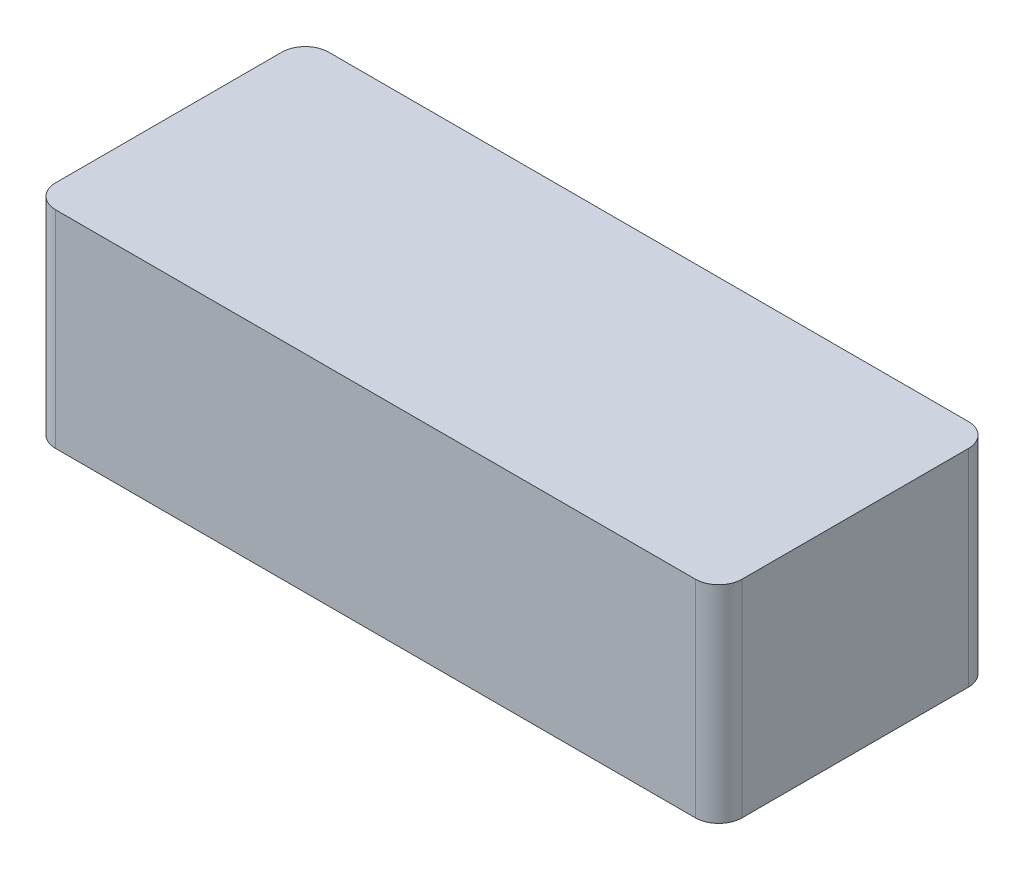
ISO-10303-21;
HEADER;
FILE_DESCRIPTION(('STEP AP214'),'2;1');
FILE_NAME('part.step','',(''),(''),'','','');
FILE_SCHEMA(('AUTOMOTIVE_DESIGN { 1 0 10303 214 1 1 1 1 }'));
ENDSEC;
DATA;
#1=APPLICATION_CONTEXT('core data for automotive mechanical design processes');
#2=APPLICATION_PROTOCOL_DEFINITION('international standard','automotive_design',2000,#1);
#3=PRODUCT_CONTEXT('',#1,'mechanical');
#4=PRODUCT('Part','Part','',(#3));
#5=PRODUCT_RELATED_PRODUCT_CATEGORY('part','',(#4));
#6=PRODUCT_DEFINITION_FORMATION('','',#4);
#7=PRODUCT_DEFINITION_CONTEXT('part definition',#1,'design');
#8=PRODUCT_DEFINITION('design','',#6,#7);
#9=PRODUCT_DEFINITION_SHAPE('','',#8);
#10=(LENGTH_UNIT() NAMED_UNIT(*) SI_UNIT(.MILLI.,.METRE.));
#11=(NAMED_UNIT(*) PLANE_ANGLE_UNIT() SI_UNIT($,.RADIAN.));
#12=(NAMED_UNIT(*) SI_UNIT($,.STERADIAN.) SOLID_ANGLE_UNIT());
#13=UNCERTAINTY_MEASURE_WITH_UNIT(LENGTH_MEASURE(1.E-05),#10,'distance_accuracy_value','');
#14=(GEOMETRIC_REPRESENTATION_CONTEXT(3) GLOBAL_UNCERTAINTY_ASSIGNED_CONTEXT((#13)) GLOBAL_UNIT_ASSIGNED_CONTEXT((#10,
#11,#12)) REPRESENTATION_CONTEXT('',''));
#15=CARTESIAN_POINT('',(0.,0.,0.));
#16=DIRECTION('',(0.,0.,1.));
#17=DIRECTION('',(1.,0.,0.));
#18=AXIS2_PLACEMENT_3D('',#15,#16,#17);
#19=CARTESIAN_POINT('',(41.,26.5,14.5));
#20=DIRECTION('',(0.,-1.,0.));
#21=DIRECTION('',(0.,0.,-1.));
#22=AXIS2_PLACEMENT_3D('',#19,#20,#21);
#23=CYLINDRICAL_SURFACE('',#22,3.);
#24=CARTESIAN_POINT('',(41.,0.,14.5));
#25=DIRECTION('',(0.,1.,0.));
#26=DIRECTION('',(0.,0.,1.));
#27=AXIS2_PLACEMENT_3D('',#24,#25,#26);
#28=CIRCLE('',#27,3.);
#29=CARTESIAN_POINT('',(41.,0.,17.5));
#30=VERTEX_POINT('',#29);
#31=CARTESIAN_POINT('',(44.,0.,14.5));
#32=VERTEX_POINT('',#31);
#33=EDGE_CURVE('E216',#30,#32,#28,.T.);
#34=ORIENTED_EDGE('',*,*,#33,.T.);
#35=DIRECTION('',(0.,-1.,0.));
#36=VECTOR('',#35,1.);
#37=CARTESIAN_POINT('',(44.,26.5,14.5));
#38=LINE('',#37,#36);
#39=CARTESIAN_POINT('',(44.,26.5,14.5));
#40=VERTEX_POINT('',#39);
#41=EDGE_CURVE('E11',#40,#32,#38,.T.);
#42=ORIENTED_EDGE('',*,*,#41,.F.);
#43=CARTESIAN_POINT('',(41.,26.5,14.5));
#44=DIRECTION('',(0.,1.,0.));
#45=DIRECTION('',(0.,0.,1.));
#46=AXIS2_PLACEMENT_3D('',#43,#44,#45);
#47=CIRCLE('',#46,3.);
#48=CARTESIAN_POINT('',(41.,26.5,17.5));
#49=VERTEX_POINT('',#48);
#50=EDGE_CURVE('E217',#49,#40,#47,.T.);
#51=ORIENTED_EDGE('',*,*,#50,.F.);
#52=DIRECTION('',(0.,-1.,0.));
#53=VECTOR('',#52,1.);
#54=CARTESIAN_POINT('',(41.,26.5,17.5));
#55=LINE('',#54,#53);
#56=EDGE_CURVE('E235',#49,#30,#55,.T.);
#57=ORIENTED_EDGE('',*,*,#56,.T.);
#58=EDGE_LOOP('',(#34,#42,#51,#57));
#59=FACE_BOUND('',#58,.T.);
#60=ADVANCED_FACE('F43',(#59),#23,.T.);
#61=CARTESIAN_POINT('',(44.,26.5,14.5));
#62=DIRECTION('',(-1.,0.,0.));
#63=DIRECTION('',(0.,0.,1.));
#64=AXIS2_PLACEMENT_3D('',#61,#62,#63);
#65=PLANE('',#64);
#66=DIRECTION('',(0.,0.,-1.));
#67=VECTOR('',#66,1.);
#68=CARTESIAN_POINT('',(44.,0.,14.5));
#69=LINE('',#68,#67);
#70=CARTESIAN_POINT('',(44.,0.,-14.5));
#71=VERTEX_POINT('',#70);
#72=EDGE_CURVE('E238',#32,#71,#69,.T.);
#73=ORIENTED_EDGE('',*,*,#72,.T.);
#74=DIRECTION('',(0.,-1.,0.));
#75=VECTOR('',#74,1.);
#76=CARTESIAN_POINT('',(44.,26.5,-14.5));
#77=LINE('',#76,#75);
#78=CARTESIAN_POINT('',(44.,26.5,-14.5));
#79=VERTEX_POINT('',#78);
#80=EDGE_CURVE('E50',#79,#71,#77,.T.);
#81=ORIENTED_EDGE('',*,*,#80,.F.);
#82=DIRECTION('',(0.,0.,-1.));
#83=VECTOR('',#82,1.);
#84=CARTESIAN_POINT('',(44.,26.5,14.5));
#85=LINE('',#84,#83);
#86=EDGE_CURVE('E220',#40,#79,#85,.T.);
#87=ORIENTED_EDGE('',*,*,#86,.F.);
#88=ORIENTED_EDGE('',*,*,#41,.T.);
#89=EDGE_LOOP('',(#73,#81,#87,#88));
#90=FACE_BOUND('',#89,.T.);
#91=ADVANCED_FACE('F295',(#90),#65,.F.);
#92=CARTESIAN_POINT('',(41.,26.5,-14.5));
#93=DIRECTION('',(0.,-1.,0.));
#94=DIRECTION('',(0.,0.,-1.));
#95=AXIS2_PLACEMENT_3D('',#92,#93,#94);
#96=CYLINDRICAL_SURFACE('',#95,3.);
#97=CARTESIAN_POINT('',(41.,0.,-14.5));
#98=DIRECTION('',(0.,1.,0.));
#99=DIRECTION('',(0.,0.,-1.));
#100=AXIS2_PLACEMENT_3D('',#97,#98,#99);
#101=CIRCLE('',#100,3.);
#102=CARTESIAN_POINT('',(41.,0.,-17.5));
#103=VERTEX_POINT('',#102);
#104=EDGE_CURVE('E240',#71,#103,#101,.T.);
#105=ORIENTED_EDGE('',*,*,#104,.T.);
#106=DIRECTION('',(0.,-1.,0.));
#107=VECTOR('',#106,1.);
#108=CARTESIAN_POINT('',(41.,26.5,-17.5));
#109=LINE('',#108,#107);
#110=CARTESIAN_POINT('',(41.,26.5,-17.5));
#111=VERTEX_POINT('',#110);
#112=EDGE_CURVE('E265',#111,#103,#109,.T.);
#113=ORIENTED_EDGE('',*,*,#112,.F.);
#114=CARTESIAN_POINT('',(41.,26.5,-14.5));
#115=DIRECTION('',(0.,1.,0.));
#116=DIRECTION('',(0.,0.,-1.));
#117=AXIS2_PLACEMENT_3D('',#114,#115,#116);
#118=CIRCLE('',#117,3.);
#119=EDGE_CURVE('E223',#79,#111,#118,.T.);
#120=ORIENTED_EDGE('',*,*,#119,.F.);
#121=ORIENTED_EDGE('',*,*,#80,.T.);
#122=EDGE_LOOP('',(#105,#113,#120,#121));
#123=FACE_BOUND('',#122,.T.);
#124=ADVANCED_FACE('F272',(#123),#96,.T.);
#125=CARTESIAN_POINT('',(-41.,26.5,-17.5));
#126=DIRECTION('',(0.,0.,1.));
#127=DIRECTION('',(1.,0.,0.));
#128=AXIS2_PLACEMENT_3D('',#125,#126,#127);
#129=PLANE('',#128);
#130=DIRECTION('',(-1.,0.,0.));
#131=VECTOR('',#130,1.);
#132=CARTESIAN_POINT('',(-41.,0.,-17.5));
#133=LINE('',#132,#131);
#134=CARTESIAN_POINT('',(-41.,0.,-17.5));
#135=VERTEX_POINT('',#134);
#136=EDGE_CURVE('E242',#103,#135,#133,.T.);
#137=ORIENTED_EDGE('',*,*,#136,.T.);
#138=DIRECTION('',(0.,-1.,0.));
#139=VECTOR('',#138,1.);
#140=CARTESIAN_POINT('',(-41.,26.5,-17.5));
#141=LINE('',#140,#139);
#142=CARTESIAN_POINT('',(-41.,26.5,-17.5));
#143=VERTEX_POINT('',#142);
#144=EDGE_CURVE('E262',#143,#135,#141,.T.);
#145=ORIENTED_EDGE('',*,*,#144,.F.);
#146=DIRECTION('',(-1.,0.,0.));
#147=VECTOR('',#146,1.);
#148=CARTESIAN_POINT('',(-41.,26.5,-17.5));
#149=LINE('',#148,#147);
#150=EDGE_CURVE('E225',#111,#143,#149,.T.);
#151=ORIENTED_EDGE('',*,*,#150,.F.);
#152=ORIENTED_EDGE('',*,*,#112,.T.);
#153=EDGE_LOOP('',(#137,#145,#151,#152));
#154=FACE_BOUND('',#153,.T.);
#155=ADVANCED_FACE('F283',(#154),#129,.F.);
#156=CARTESIAN_POINT('',(-41.,26.5,-14.5));
#157=DIRECTION('',(0.,-1.,0.));
#158=DIRECTION('',(0.,0.,-1.));
#159=AXIS2_PLACEMENT_3D('',#156,#157,#158);
#160=CYLINDRICAL_SURFACE('',#159,3.);
#161=CARTESIAN_POINT('',(-41.,0.,-14.5));
#162=DIRECTION('',(0.,1.,0.));
#163=DIRECTION('',(0.,0.,-1.));
#164=AXIS2_PLACEMENT_3D('',#161,#162,#163);
#165=CIRCLE('',#164,3.);
#166=CARTESIAN_POINT('',(-44.,0.,-14.5));
#167=VERTEX_POINT('',#166);
#168=EDGE_CURVE('E244',#135,#167,#165,.T.);
#169=ORIENTED_EDGE('',*,*,#168,.T.);
#170=DIRECTION('',(0.,-1.,0.));
#171=VECTOR('',#170,1.);
#172=CARTESIAN_POINT('',(-44.,26.5,-14.5));
#173=LINE('',#172,#171);
#174=CARTESIAN_POINT('',(-44.,26.5,-14.5));
#175=VERTEX_POINT('',#174);
#176=EDGE_CURVE('E259',#175,#167,#173,.T.);
#177=ORIENTED_EDGE('',*,*,#176,.F.);
#178=CARTESIAN_POINT('',(-41.,26.5,-14.5));
#179=DIRECTION('',(0.,1.,0.));
#180=DIRECTION('',(0.,0.,-1.));
#181=AXIS2_PLACEMENT_3D('',#178,#179,#180);
#182=CIRCLE('',#181,3.);
#183=EDGE_CURVE('E227',#143,#175,#182,.T.);
#184=ORIENTED_EDGE('',*,*,#183,.F.);
#185=ORIENTED_EDGE('',*,*,#144,.T.);
#186=EDGE_LOOP('',(#169,#177,#184,#185));
#187=FACE_BOUND('',#186,.T.);
#188=ADVANCED_FACE('F287',(#187),#160,.T.);
#189=CARTESIAN_POINT('',(-44.,26.5,14.5));
#190=DIRECTION('',(1.,0.,0.));
#191=DIRECTION('',(0.,0.,-1.));
#192=AXIS2_PLACEMENT_3D('',#189,#190,#191);
#193=PLANE('',#192);
#194=DIRECTION('',(0.,-1.,0.));
#195=VECTOR('',#194,1.);
#196=CARTESIAN_POINT('',(-44.,18.,-4.99999999999999));
#197=LINE('',#196,#195);
#198=CARTESIAN_POINT('',(-44.,18.,-5.));
#199=VERTEX_POINT('',#198);
#200=CARTESIAN_POINT('',(-44.,8.,-5.));
#201=VERTEX_POINT('',#200);
#202=EDGE_CURVE('E62',#199,#201,#197,.T.);
#203=ORIENTED_EDGE('',*,*,#202,.F.);
#204=DIRECTION('',(0.,0.,-1.));
#205=VECTOR('',#204,1.);
#206=CARTESIAN_POINT('',(-44.,18.,4.99999999999999));
#207=LINE('',#206,#205);
#208=CARTESIAN_POINT('',(-44.,18.,5.));
#209=VERTEX_POINT('',#208);
#210=EDGE_CURVE('E57',#209,#199,#207,.T.);
#211=ORIENTED_EDGE('',*,*,#210,.F.);
#212=DIRECTION('',(0.,-1.,0.));
#213=VECTOR('',#212,1.);
#214=CARTESIAN_POINT('',(-44.,18.,4.99999999999999));
#215=LINE('',#214,#213);
#216=CARTESIAN_POINT('',(-44.,8.,4.99999999999999));
#217=VERTEX_POINT('',#216);
#218=EDGE_CURVE('E214',#209,#217,#215,.T.);
#219=ORIENTED_EDGE('',*,*,#218,.T.);
#220=DIRECTION('',(0.,0.,-1.));
#221=VECTOR('',#220,1.);
#222=CARTESIAN_POINT('',(-44.,8.,4.99999999999999));
#223=LINE('',#222,#221);
#224=EDGE_CURVE('E187',#217,#201,#223,.T.);
#225=ORIENTED_EDGE('',*,*,#224,.T.);
#226=EDGE_LOOP('',(#203,#211,#219,#225));
#227=FACE_BOUND('',#226,.T.);
#228=DIRECTION('',(0.,0.,1.));
#229=VECTOR('',#228,1.);
#230=CARTESIAN_POINT('',(-44.,0.,14.5));
#231=LINE('',#230,#229);
#232=CARTESIAN_POINT('',(-44.,0.,14.5));
#233=VERTEX_POINT('',#232);
#234=EDGE_CURVE('E246',#167,#233,#231,.T.);
#235=ORIENTED_EDGE('',*,*,#234,.T.);
#236=DIRECTION('',(0.,-1.,0.));
#237=VECTOR('',#236,1.);
#238=CARTESIAN_POINT('',(-44.,26.5,14.5));
#239=LINE('',#238,#237);
#240=CARTESIAN_POINT('',(-44.,26.5,14.5));
#241=VERTEX_POINT('',#240);
#242=EDGE_CURVE('E256',#241,#233,#239,.T.);
#243=ORIENTED_EDGE('',*,*,#242,.F.);
#244=DIRECTION('',(0.,0.,1.));
#245=VECTOR('',#244,1.);
#246=CARTESIAN_POINT('',(-44.,26.5,14.5));
#247=LINE('',#246,#245);
#248=EDGE_CURVE('E229',#175,#241,#247,.T.);
#249=ORIENTED_EDGE('',*,*,#248,.F.);
#250=ORIENTED_EDGE('',*,*,#176,.T.);
#251=EDGE_LOOP('',(#235,#243,#249,#250));
#252=FACE_BOUND('',#251,.T.);
#253=ADVANCED_FACE('F308',(#227,#252),#193,.F.);
#254=CARTESIAN_POINT('',(-41.,26.5,14.5));
#255=DIRECTION('',(0.,-1.,0.));
#256=DIRECTION('',(0.,0.,-1.));
#257=AXIS2_PLACEMENT_3D('',#254,#255,#256);
#258=CYLINDRICAL_SURFACE('',#257,3.);
#259=CARTESIAN_POINT('',(-41.,0.,14.5));
#260=DIRECTION('',(0.,1.,0.));
#261=DIRECTION('',(0.,0.,-1.));
#262=AXIS2_PLACEMENT_3D('',#259,#260,#261);
#263=CIRCLE('',#262,3.);
#264=CARTESIAN_POINT('',(-41.,0.,17.5));
#265=VERTEX_POINT('',#264);
#266=EDGE_CURVE('E248',#233,#265,#263,.T.);
#267=ORIENTED_EDGE('',*,*,#266,.T.);
#268=DIRECTION('',(0.,-1.,0.));
#269=VECTOR('',#268,1.);
#270=CARTESIAN_POINT('',(-41.,26.5,17.5));
#271=LINE('',#270,#269);
#272=CARTESIAN_POINT('',(-41.,26.5,17.5));
#273=VERTEX_POINT('',#272);
#274=EDGE_CURVE('E253',#273,#265,#271,.T.);
#275=ORIENTED_EDGE('',*,*,#274,.F.);
#276=CARTESIAN_POINT('',(-41.,26.5,14.5));
#277=DIRECTION('',(0.,1.,0.));
#278=DIRECTION('',(0.,0.,-1.));
#279=AXIS2_PLACEMENT_3D('',#276,#277,#278);
#280=CIRCLE('',#279,3.);
#281=EDGE_CURVE('E231',#241,#273,#280,.T.);
#282=ORIENTED_EDGE('',*,*,#281,.F.);
#283=ORIENTED_EDGE('',*,*,#242,.T.);
#284=EDGE_LOOP('',(#267,#275,#282,#283));
#285=FACE_BOUND('',#284,.T.);
#286=ADVANCED_FACE('F306',(#285),#258,.T.);
#287=CARTESIAN_POINT('',(-41.,26.5,17.5));
#288=DIRECTION('',(0.,0.,-1.));
#289=DIRECTION('',(-1.,0.,0.));
#290=AXIS2_PLACEMENT_3D('',#287,#288,#289);
#291=PLANE('',#290);
#292=DIRECTION('',(1.,0.,0.));
#293=VECTOR('',#292,1.);
#294=CARTESIAN_POINT('',(-41.,0.,17.5));
#295=LINE('',#294,#293);
#296=EDGE_CURVE('E221',#265,#30,#295,.T.);
#297=ORIENTED_EDGE('',*,*,#296,.T.);
#298=ORIENTED_EDGE('',*,*,#56,.F.);
#299=DIRECTION('',(1.,0.,0.));
#300=VECTOR('',#299,1.);
#301=CARTESIAN_POINT('',(-41.,26.5,17.5));
#302=LINE('',#301,#300);
#303=EDGE_CURVE('E233',#273,#49,#302,.T.);
#304=ORIENTED_EDGE('',*,*,#303,.F.);
#305=ORIENTED_EDGE('',*,*,#274,.T.);
#306=EDGE_LOOP('',(#297,#298,#304,#305));
#307=FACE_BOUND('',#306,.T.);
#308=ADVANCED_FACE('F301',(#307),#291,.F.);
#309=CARTESIAN_POINT('',(41.,26.5,14.5));
#310=DIRECTION('',(0.,1.,0.));
#311=DIRECTION('',(0.,0.,1.));
#312=AXIS2_PLACEMENT_3D('',#309,#310,#311);
#313=PLANE('',#312);
#314=ORIENTED_EDGE('',*,*,#50,.T.);
#315=ORIENTED_EDGE('',*,*,#86,.T.);
#316=ORIENTED_EDGE('',*,*,#119,.T.);
#317=ORIENTED_EDGE('',*,*,#150,.T.);
#318=ORIENTED_EDGE('',*,*,#183,.T.);
#319=ORIENTED_EDGE('',*,*,#248,.T.);
#320=ORIENTED_EDGE('',*,*,#281,.T.);
#321=ORIENTED_EDGE('',*,*,#303,.T.);
#322=EDGE_LOOP('',(#314,#315,#316,#317,#318,#319,#320,#321));
#323=FACE_BOUND('',#322,.T.);
#324=ADVANCED_FACE('F291',(#323),#313,.T.);
#325=CARTESIAN_POINT('',(41.,0.,14.5));
#326=DIRECTION('',(0.,1.,0.));
#327=DIRECTION('',(0.,0.,1.));
#328=AXIS2_PLACEMENT_3D('',#325,#326,#327);
#329=PLANE('',#328);
#330=ORIENTED_EDGE('',*,*,#33,.F.);
#331=ORIENTED_EDGE('',*,*,#296,.F.);
#332=ORIENTED_EDGE('',*,*,#266,.F.);
#333=ORIENTED_EDGE('',*,*,#234,.F.);
#334=ORIENTED_EDGE('',*,*,#168,.F.);
#335=ORIENTED_EDGE('',*,*,#136,.F.);
#336=ORIENTED_EDGE('',*,*,#104,.F.);
#337=ORIENTED_EDGE('',*,*,#72,.F.);
#338=EDGE_LOOP('',(#330,#331,#332,#333,#334,#335,#336,#337));
#339=FACE_BOUND('',#338,.T.);
#340=ADVANCED_FACE('F278',(#339),#329,.F.);
#341=CARTESIAN_POINT('',(-45.,18.,5.));
#342=DIRECTION('',(0.,-1.,0.));
#343=DIRECTION('',(0.,0.,-1.));
#344=AXIS2_PLACEMENT_3D('',#341,#342,#343);
#345=CYLINDRICAL_SURFACE('',#344,1.);
#346=CARTESIAN_POINT('',(-45.,8.,5.));
#347=DIRECTION('',(0.,1.,0.));
#348=DIRECTION('',(0.,0.,1.));
#349=AXIS2_PLACEMENT_3D('',#346,#347,#348);
#350=CIRCLE('',#349,1.);
#351=CARTESIAN_POINT('',(-45.,8.,6.));
#352=VERTEX_POINT('',#351);
#353=EDGE_CURVE('E184',#352,#217,#350,.T.);
#354=ORIENTED_EDGE('',*,*,#353,.T.);
#355=ORIENTED_EDGE('',*,*,#218,.F.);
#356=CARTESIAN_POINT('',(-45.,18.,5.));
#357=DIRECTION('',(0.,1.,0.));
#358=DIRECTION('',(0.,0.,1.));
#359=AXIS2_PLACEMENT_3D('',#356,#357,#358);
#360=CIRCLE('',#359,1.);
#361=CARTESIAN_POINT('',(-45.,18.,6.));
#362=VERTEX_POINT('',#361);
#363=EDGE_CURVE('E200',#362,#209,#360,.T.);
#364=ORIENTED_EDGE('',*,*,#363,.F.);
#365=DIRECTION('',(0.,-1.,0.));
#366=VECTOR('',#365,1.);
#367=CARTESIAN_POINT('',(-45.,18.,6.));
#368=LINE('',#367,#366);
#369=EDGE_CURVE('E183',#362,#352,#368,.T.);
#370=ORIENTED_EDGE('',*,*,#369,.T.);
#371=EDGE_LOOP('',(#354,#355,#364,#370));
#372=FACE_BOUND('',#371,.T.);
#373=ADVANCED_FACE('F371',(#372),#345,.T.);
#374=CARTESIAN_POINT('',(-45.,18.,-5.));
#375=DIRECTION('',(0.,-1.,0.));
#376=DIRECTION('',(0.,0.,-1.));
#377=AXIS2_PLACEMENT_3D('',#374,#375,#376);
#378=CYLINDRICAL_SURFACE('',#377,1.);
#379=CARTESIAN_POINT('',(-45.,8.,-5.));
#380=DIRECTION('',(0.,1.,0.));
#381=DIRECTION('',(0.,0.,-1.));
#382=AXIS2_PLACEMENT_3D('',#379,#380,#381);
#383=CIRCLE('',#382,1.);
#384=CARTESIAN_POINT('',(-45.,8.,-6.));
#385=VERTEX_POINT('',#384);
#386=EDGE_CURVE('E164',#201,#385,#383,.T.);
#387=ORIENTED_EDGE('',*,*,#386,.T.);
#388=DIRECTION('',(0.,-1.,0.));
#389=VECTOR('',#388,1.);
#390=CARTESIAN_POINT('',(-45.,18.,-6.));
#391=LINE('',#390,#389);
#392=CARTESIAN_POINT('',(-45.,18.,-6.));
#393=VERTEX_POINT('',#392);
#394=EDGE_CURVE('E161',#393,#385,#391,.T.);
#395=ORIENTED_EDGE('',*,*,#394,.F.);
#396=CARTESIAN_POINT('',(-45.,18.,-5.));
#397=DIRECTION('',(0.,1.,0.));
#398=DIRECTION('',(0.,0.,-1.));
#399=AXIS2_PLACEMENT_3D('',#396,#397,#398);
#400=CIRCLE('',#399,1.);
#401=EDGE_CURVE('E152',#199,#393,#400,.T.);
#402=ORIENTED_EDGE('',*,*,#401,.F.);
#403=ORIENTED_EDGE('',*,*,#202,.T.);
#404=EDGE_LOOP('',(#387,#395,#402,#403));
#405=FACE_BOUND('',#404,.T.);
#406=ADVANCED_FACE('F162',(#405),#378,.T.);
#407=CARTESIAN_POINT('',(-51.,18.,-6.));
#408=DIRECTION('',(0.,0.,1.));
#409=DIRECTION('',(1.,0.,0.));
#410=AXIS2_PLACEMENT_3D('',#407,#408,#409);
#411=PLANE('',#410);
#412=DIRECTION('',(-1.,0.,0.));
#413=VECTOR('',#412,1.);
#414=CARTESIAN_POINT('',(-51.,8.,-6.));
#415=LINE('',#414,#413);
#416=CARTESIAN_POINT('',(-51.,8.,-6.));
#417=VERTEX_POINT('',#416);
#418=EDGE_CURVE('E190',#385,#417,#415,.T.);
#419=ORIENTED_EDGE('',*,*,#418,.T.);
#420=DIRECTION('',(0.,-1.,0.));
#421=VECTOR('',#420,1.);
#422=CARTESIAN_POINT('',(-51.,18.,-6.));
#423=LINE('',#422,#421);
#424=CARTESIAN_POINT('',(-51.,18.,-6.));
#425=VERTEX_POINT('',#424);
#426=EDGE_CURVE('E167',#425,#417,#423,.T.);
#427=ORIENTED_EDGE('',*,*,#426,.F.);
#428=DIRECTION('',(-1.,0.,0.));
#429=VECTOR('',#428,1.);
#430=CARTESIAN_POINT('',(-51.,18.,-6.));
#431=LINE('',#430,#429);
#432=EDGE_CURVE('E156',#393,#425,#431,.T.);
#433=ORIENTED_EDGE('',*,*,#432,.F.);
#434=ORIENTED_EDGE('',*,*,#394,.T.);
#435=EDGE_LOOP('',(#419,#427,#433,#434));
#436=FACE_BOUND('',#435,.T.);
#437=ADVANCED_FACE('F169',(#436),#411,.F.);
#438=CARTESIAN_POINT('',(-51.,18.,-5.));
#439=DIRECTION('',(0.,-1.,0.));
#440=DIRECTION('',(0.,0.,-1.));
#441=AXIS2_PLACEMENT_3D('',#438,#439,#440);
#442=CYLINDRICAL_SURFACE('',#441,1.);
#443=CARTESIAN_POINT('',(-51.,8.,-5.));
#444=DIRECTION('',(0.,1.,0.));
#445=DIRECTION('',(0.,0.,-1.));
#446=AXIS2_PLACEMENT_3D('',#443,#444,#445);
#447=CIRCLE('',#446,1.);
#448=CARTESIAN_POINT('',(-52.,8.,-4.99999999999999));
#449=VERTEX_POINT('',#448);
#450=EDGE_CURVE('E192',#417,#449,#447,.T.);
#451=ORIENTED_EDGE('',*,*,#450,.T.);
#452=DIRECTION('',(0.,-1.,0.));
#453=VECTOR('',#452,1.);
#454=CARTESIAN_POINT('',(-52.,18.,-4.99999999999999));
#455=LINE('',#454,#453);
#456=CARTESIAN_POINT('',(-52.,18.,-4.99999999999999));
#457=VERTEX_POINT('',#456);
#458=EDGE_CURVE('E209',#457,#449,#455,.T.);
#459=ORIENTED_EDGE('',*,*,#458,.F.);
#460=CARTESIAN_POINT('',(-51.,18.,-5.));
#461=DIRECTION('',(0.,1.,0.));
#462=DIRECTION('',(0.,0.,-1.));
#463=AXIS2_PLACEMENT_3D('',#460,#461,#462);
#464=CIRCLE('',#463,1.);
#465=EDGE_CURVE('E172',#425,#457,#464,.T.);
#466=ORIENTED_EDGE('',*,*,#465,.F.);
#467=ORIENTED_EDGE('',*,*,#426,.T.);
#468=EDGE_LOOP('',(#451,#459,#466,#467));
#469=FACE_BOUND('',#468,.T.);
#470=ADVANCED_FACE('F396',(#469),#442,.T.);
#471=CARTESIAN_POINT('',(-52.,18.,4.99999999999999));
#472=DIRECTION('',(1.,0.,0.));
#473=DIRECTION('',(0.,0.,-1.));
#474=AXIS2_PLACEMENT_3D('',#471,#472,#473);
#475=PLANE('',#474);
#476=DIRECTION('',(0.,0.,1.));
#477=VECTOR('',#476,1.);
#478=CARTESIAN_POINT('',(-52.,8.,4.99999999999999));
#479=LINE('',#478,#477);
#480=CARTESIAN_POINT('',(-52.,8.,4.99999999999999));
#481=VERTEX_POINT('',#480);
#482=EDGE_CURVE('E194',#449,#481,#479,.T.);
#483=ORIENTED_EDGE('',*,*,#482,.T.);
#484=DIRECTION('',(0.,-1.,0.));
#485=VECTOR('',#484,1.);
#486=CARTESIAN_POINT('',(-52.,18.,4.99999999999999));
#487=LINE('',#486,#485);
#488=CARTESIAN_POINT('',(-52.,18.,4.99999999999999));
#489=VERTEX_POINT('',#488);
#490=EDGE_CURVE('E206',#489,#481,#487,.T.);
#491=ORIENTED_EDGE('',*,*,#490,.F.);
#492=DIRECTION('',(0.,0.,1.));
#493=VECTOR('',#492,1.);
#494=CARTESIAN_POINT('',(-52.,18.,4.99999999999999));
#495=LINE('',#494,#493);
#496=EDGE_CURVE('E174',#457,#489,#495,.T.);
#497=ORIENTED_EDGE('',*,*,#496,.F.);
#498=ORIENTED_EDGE('',*,*,#458,.T.);
#499=EDGE_LOOP('',(#483,#491,#497,#498));
#500=FACE_BOUND('',#499,.T.);
#501=ADVANCED_FACE('F405',(#500),#475,.F.);
#502=CARTESIAN_POINT('',(-51.,18.,5.));
#503=DIRECTION('',(0.,-1.,0.));
#504=DIRECTION('',(0.,0.,-1.));
#505=AXIS2_PLACEMENT_3D('',#502,#503,#504);
#506=CYLINDRICAL_SURFACE('',#505,1.);
#507=CARTESIAN_POINT('',(-51.,8.,5.));
#508=DIRECTION('',(0.,1.,0.));
#509=DIRECTION('',(0.,0.,-1.));
#510=AXIS2_PLACEMENT_3D('',#507,#508,#509);
#511=CIRCLE('',#510,1.);
#512=CARTESIAN_POINT('',(-51.,8.,6.));
#513=VERTEX_POINT('',#512);
#514=EDGE_CURVE('E196',#481,#513,#511,.T.);
#515=ORIENTED_EDGE('',*,*,#514,.T.);
#516=DIRECTION('',(0.,-1.,0.));
#517=VECTOR('',#516,1.);
#518=CARTESIAN_POINT('',(-51.,18.,6.));
#519=LINE('',#518,#517);
#520=CARTESIAN_POINT('',(-51.,18.,6.));
#521=VERTEX_POINT('',#520);
#522=EDGE_CURVE('E203',#521,#513,#519,.T.);
#523=ORIENTED_EDGE('',*,*,#522,.F.);
#524=CARTESIAN_POINT('',(-51.,18.,5.));
#525=DIRECTION('',(0.,1.,0.));
#526=DIRECTION('',(0.,0.,-1.));
#527=AXIS2_PLACEMENT_3D('',#524,#525,#526);
#528=CIRCLE('',#527,1.);
#529=EDGE_CURVE('E179',#489,#521,#528,.T.);
#530=ORIENTED_EDGE('',*,*,#529,.F.);
#531=ORIENTED_EDGE('',*,*,#490,.T.);
#532=EDGE_LOOP('',(#515,#523,#530,#531));
#533=FACE_BOUND('',#532,.T.);
#534=ADVANCED_FACE('F415',(#533),#506,.T.);
#535=CARTESIAN_POINT('',(-51.,18.,6.));
#536=DIRECTION('',(0.,0.,-1.));
#537=DIRECTION('',(-1.,0.,0.));
#538=AXIS2_PLACEMENT_3D('',#535,#536,#537);
#539=PLANE('',#538);
#540=DIRECTION('',(1.,0.,0.));
#541=VECTOR('',#540,1.);
#542=CARTESIAN_POINT('',(-51.,8.,6.));
#543=LINE('',#542,#541);
#544=EDGE_CURVE('E198',#513,#352,#543,.T.);
#545=ORIENTED_EDGE('',*,*,#544,.T.);
#546=ORIENTED_EDGE('',*,*,#369,.F.);
#547=DIRECTION('',(1.,0.,0.));
#548=VECTOR('',#547,1.);
#549=CARTESIAN_POINT('',(-51.,18.,6.));
#550=LINE('',#549,#548);
#551=EDGE_CURVE('E181',#521,#362,#550,.T.);
#552=ORIENTED_EDGE('',*,*,#551,.F.);
#553=ORIENTED_EDGE('',*,*,#522,.T.);
#554=EDGE_LOOP('',(#545,#546,#552,#553));
#555=FACE_BOUND('',#554,.T.);
#556=ADVANCED_FACE('F425',(#555),#539,.F.);
#557=CARTESIAN_POINT('',(-45.,18.,5.));
#558=DIRECTION('',(0.,1.,0.));
#559=DIRECTION('',(0.,0.,1.));
#560=AXIS2_PLACEMENT_3D('',#557,#558,#559);
#561=PLANE('',#560);
#562=ORIENTED_EDGE('',*,*,#363,.T.);
#563=ORIENTED_EDGE('',*,*,#210,.T.);
#564=ORIENTED_EDGE('',*,*,#401,.T.);
#565=ORIENTED_EDGE('',*,*,#432,.T.);
#566=ORIENTED_EDGE('',*,*,#465,.T.);
#567=ORIENTED_EDGE('',*,*,#496,.T.);
#568=ORIENTED_EDGE('',*,*,#529,.T.);
#569=ORIENTED_EDGE('',*,*,#551,.T.);
#570=EDGE_LOOP('',(#562,#563,#564,#565,#566,#567,#568,#569));
#571=FACE_BOUND('',#570,.T.);
#572=ADVANCED_FACE('F154',(#571),#561,.T.);
#573=CARTESIAN_POINT('',(-45.,8.,5.));
#574=DIRECTION('',(0.,1.,0.));
#575=DIRECTION('',(0.,0.,1.));
#576=AXIS2_PLACEMENT_3D('',#573,#574,#575);
#577=PLANE('',#576);
#578=ORIENTED_EDGE('',*,*,#353,.F.);
#579=ORIENTED_EDGE('',*,*,#544,.F.);
#580=ORIENTED_EDGE('',*,*,#514,.F.);
#581=ORIENTED_EDGE('',*,*,#482,.F.);
#582=ORIENTED_EDGE('',*,*,#450,.F.);
#583=ORIENTED_EDGE('',*,*,#418,.F.);
#584=ORIENTED_EDGE('',*,*,#386,.F.);
#585=ORIENTED_EDGE('',*,*,#224,.F.);
#586=EDGE_LOOP('',(#578,#579,#580,#581,#582,#583,#584,#585));
#587=FACE_BOUND('',#586,.T.);
#588=ADVANCED_FACE('F444',(#587),#577,.F.);
#589=CLOSED_SHELL('',(#60,#91,#124,#155,#188,#253,#286,#308,#324,#340,#373,#406,#437,#470,#501,
#534,#556,#572,#588));
#590=MANIFOLD_SOLID_BREP('B2',#589);
#591=ADVANCED_BREP_SHAPE_REPRESENTATION('',(#18,#590),#14);
#592=SHAPE_DEFINITION_REPRESENTATION(#9,#591);
ENDSEC;
END-ISO-10303-21;
